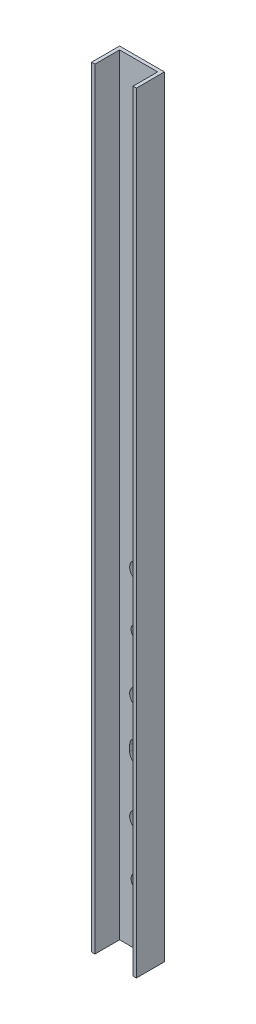
ISO-10303-21;
HEADER;
FILE_DESCRIPTION(('STEP AP214'),'2;1');
FILE_NAME('part.step','',(''),(''),'','','');
FILE_SCHEMA(('AUTOMOTIVE_DESIGN { 1 0 10303 214 1 1 1 1 }'));
ENDSEC;
DATA;
#1=APPLICATION_CONTEXT('core data for automotive mechanical design processes');
#2=APPLICATION_PROTOCOL_DEFINITION('international standard','automotive_design',2000,#1);
#3=PRODUCT_CONTEXT('',#1,'mechanical');
#4=PRODUCT('Part','Part','',(#3));
#5=PRODUCT_RELATED_PRODUCT_CATEGORY('part','',(#4));
#6=PRODUCT_DEFINITION_FORMATION('','',#4);
#7=PRODUCT_DEFINITION_CONTEXT('part definition',#1,'design');
#8=PRODUCT_DEFINITION('design','',#6,#7);
#9=PRODUCT_DEFINITION_SHAPE('','',#8);
#10=(LENGTH_UNIT() NAMED_UNIT(*) SI_UNIT(.MILLI.,.METRE.));
#11=(NAMED_UNIT(*) PLANE_ANGLE_UNIT() SI_UNIT($,.RADIAN.));
#12=(NAMED_UNIT(*) SI_UNIT($,.STERADIAN.) SOLID_ANGLE_UNIT());
#13=UNCERTAINTY_MEASURE_WITH_UNIT(LENGTH_MEASURE(1.E-05),#10,'distance_accuracy_value','');
#14=(GEOMETRIC_REPRESENTATION_CONTEXT(3) GLOBAL_UNCERTAINTY_ASSIGNED_CONTEXT((#13)) GLOBAL_UNIT_ASSIGNED_CONTEXT((#10,
#11,#12)) REPRESENTATION_CONTEXT('',''));
#15=CARTESIAN_POINT('',(0.,0.,0.));
#16=DIRECTION('',(0.,0.,1.));
#17=DIRECTION('',(1.,0.,0.));
#18=AXIS2_PLACEMENT_3D('',#15,#16,#17);
#19=CARTESIAN_POINT('',(0.,275.,0.));
#20=DIRECTION('',(0.,0.,-1.));
#21=DIRECTION('',(-1.,0.,0.));
#22=AXIS2_PLACEMENT_3D('',#19,#20,#21);
#23=PLANE('',#22);
#24=DIRECTION('',(1.,0.,0.));
#25=VECTOR('',#24,1.);
#26=CARTESIAN_POINT('',(0.,0.,0.));
#27=LINE('',#26,#25);
#28=CARTESIAN_POINT('',(0.,0.,0.));
#29=VERTEX_POINT('',#28);
#30=CARTESIAN_POINT('',(1.2,0.,0.));
#31=VERTEX_POINT('',#30);
#32=EDGE_CURVE('E195',#29,#31,#27,.T.);
#33=ORIENTED_EDGE('',*,*,#32,.T.);
#34=DIRECTION('',(0.,-1.,0.));
#35=VECTOR('',#34,1.);
#36=CARTESIAN_POINT('',(1.2,275.,0.));
#37=LINE('',#36,#35);
#38=CARTESIAN_POINT('',(1.2,275.,0.));
#39=VERTEX_POINT('',#38);
#40=EDGE_CURVE('E11',#39,#31,#37,.T.);
#41=ORIENTED_EDGE('',*,*,#40,.F.);
#42=DIRECTION('',(1.,0.,0.));
#43=VECTOR('',#42,1.);
#44=CARTESIAN_POINT('',(0.,275.,0.));
#45=LINE('',#44,#43);
#46=CARTESIAN_POINT('',(0.,275.,0.));
#47=VERTEX_POINT('',#46);
#48=EDGE_CURVE('E196',#47,#39,#45,.T.);
#49=ORIENTED_EDGE('',*,*,#48,.F.);
#50=DIRECTION('',(0.,-1.,0.));
#51=VECTOR('',#50,1.);
#52=CARTESIAN_POINT('',(0.,275.,0.));
#53=LINE('',#52,#51);
#54=EDGE_CURVE('E214',#47,#29,#53,.T.);
#55=ORIENTED_EDGE('',*,*,#54,.T.);
#56=EDGE_LOOP('',(#33,#41,#49,#55));
#57=FACE_BOUND('',#56,.T.);
#58=ADVANCED_FACE('F17',(#57),#23,.F.);
#59=CARTESIAN_POINT('',(1.2,275.,0.));
#60=DIRECTION('',(-1.,0.,0.));
#61=DIRECTION('',(0.,0.,1.));
#62=AXIS2_PLACEMENT_3D('',#59,#60,#61);
#63=PLANE('',#62);
#64=DIRECTION('',(0.,0.,-1.));
#65=VECTOR('',#64,1.);
#66=CARTESIAN_POINT('',(1.2,0.,0.));
#67=LINE('',#66,#65);
#68=CARTESIAN_POINT('',(1.2,0.,-8.8));
#69=VERTEX_POINT('',#68);
#70=EDGE_CURVE('E217',#31,#69,#67,.T.);
#71=ORIENTED_EDGE('',*,*,#70,.T.);
#72=DIRECTION('',(0.,-1.,0.));
#73=VECTOR('',#72,1.);
#74=CARTESIAN_POINT('',(1.2,275.,-8.8));
#75=LINE('',#74,#73);
#76=CARTESIAN_POINT('',(1.2,275.,-8.8));
#77=VERTEX_POINT('',#76);
#78=EDGE_CURVE('E24',#77,#69,#75,.T.);
#79=ORIENTED_EDGE('',*,*,#78,.F.);
#80=DIRECTION('',(0.,0.,-1.));
#81=VECTOR('',#80,1.);
#82=CARTESIAN_POINT('',(1.2,275.,0.));
#83=LINE('',#82,#81);
#84=EDGE_CURVE('E199',#39,#77,#83,.T.);
#85=ORIENTED_EDGE('',*,*,#84,.F.);
#86=ORIENTED_EDGE('',*,*,#40,.T.);
#87=EDGE_LOOP('',(#71,#79,#85,#86));
#88=FACE_BOUND('',#87,.T.);
#89=ADVANCED_FACE('F278',(#88),#63,.F.);
#90=CARTESIAN_POINT('',(1.2,275.,-8.8));
#91=DIRECTION('',(0.,0.,-1.));
#92=DIRECTION('',(-1.,0.,0.));
#93=AXIS2_PLACEMENT_3D('',#90,#91,#92);
#94=PLANE('',#93);
#95=DIRECTION('',(0.,1.,0.));
#96=VECTOR('',#95,1.);
#97=CARTESIAN_POINT('',(4.8000000000001,275.,-8.8));
#98=LINE('',#97,#96);
#99=CARTESIAN_POINT('',(4.8,60.,-8.8));
#100=VERTEX_POINT('',#99);
#101=CARTESIAN_POINT('',(4.8,62.,-8.8));
#102=VERTEX_POINT('',#101);
#103=EDGE_CURVE('E156',#100,#102,#98,.T.);
#104=ORIENTED_EDGE('',*,*,#103,.T.);
#105=CARTESIAN_POINT('',(8.,62.,-8.8));
#106=DIRECTION('',(0.,0.,-1.));
#107=DIRECTION('',(-1.,0.,0.));
#108=AXIS2_PLACEMENT_3D('',#105,#106,#107);
#109=CIRCLE('',#108,3.2);
#110=CARTESIAN_POINT('',(11.2,62.,-8.8));
#111=VERTEX_POINT('',#110);
#112=EDGE_CURVE('E159',#102,#111,#109,.T.);
#113=ORIENTED_EDGE('',*,*,#112,.T.);
#114=DIRECTION('',(0.,-1.,0.));
#115=VECTOR('',#114,1.);
#116=CARTESIAN_POINT('',(11.2,275.,-8.8));
#117=LINE('',#116,#115);
#118=CARTESIAN_POINT('',(11.2,60.,-8.8));
#119=VERTEX_POINT('',#118);
#120=EDGE_CURVE('E147',#111,#119,#117,.T.);
#121=ORIENTED_EDGE('',*,*,#120,.T.);
#122=CARTESIAN_POINT('',(8.,60.,-8.8));
#123=DIRECTION('',(0.,0.,-1.));
#124=DIRECTION('',(-1.,0.,0.));
#125=AXIS2_PLACEMENT_3D('',#122,#123,#124);
#126=CIRCLE('',#125,3.2);
#127=EDGE_CURVE('E120',#119,#100,#126,.T.);
#128=ORIENTED_EDGE('',*,*,#127,.T.);
#129=EDGE_LOOP('',(#104,#113,#121,#128));
#130=FACE_BOUND('',#129,.T.);
#131=CARTESIAN_POINT('',(8.,98.,-8.8));
#132=DIRECTION('',(0.,0.,-1.));
#133=DIRECTION('',(-1.,0.,0.));
#134=AXIS2_PLACEMENT_3D('',#131,#132,#133);
#135=CIRCLE('',#134,2.7);
#136=CARTESIAN_POINT('',(5.3,98.,-8.8));
#137=VERTEX_POINT('',#136);
#138=EDGE_CURVE('E166',#137,#137,#135,.T.);
#139=ORIENTED_EDGE('',*,*,#138,.T.);
#140=EDGE_LOOP('',(#139));
#141=FACE_BOUND('',#140,.T.);
#142=CARTESIAN_POINT('',(8.,117.,-8.8));
#143=DIRECTION('',(0.,0.,-1.));
#144=DIRECTION('',(-1.,0.,0.));
#145=AXIS2_PLACEMENT_3D('',#142,#143,#144);
#146=CIRCLE('',#145,3.2);
#147=CARTESIAN_POINT('',(4.8,117.,-8.8));
#148=VERTEX_POINT('',#147);
#149=EDGE_CURVE('E172',#148,#148,#146,.T.);
#150=ORIENTED_EDGE('',*,*,#149,.T.);
#151=EDGE_LOOP('',(#150));
#152=FACE_BOUND('',#151,.T.);
#153=CARTESIAN_POINT('',(8.,78.,-8.8));
#154=DIRECTION('',(0.,0.,-1.));
#155=DIRECTION('',(-1.,0.,0.));
#156=AXIS2_PLACEMENT_3D('',#153,#154,#155);
#157=CIRCLE('',#156,3.2);
#158=CARTESIAN_POINT('',(4.8,78.,-8.8));
#159=VERTEX_POINT('',#158);
#160=EDGE_CURVE('E179',#159,#159,#157,.T.);
#161=ORIENTED_EDGE('',*,*,#160,.T.);
#162=EDGE_LOOP('',(#161));
#163=FACE_BOUND('',#162,.T.);
#164=CARTESIAN_POINT('',(8.,40.,-8.8));
#165=DIRECTION('',(0.,0.,-1.));
#166=DIRECTION('',(-1.,0.,0.));
#167=AXIS2_PLACEMENT_3D('',#164,#165,#166);
#168=CIRCLE('',#167,3.2);
#169=CARTESIAN_POINT('',(4.8,40.,-8.8));
#170=VERTEX_POINT('',#169);
#171=EDGE_CURVE('E186',#170,#170,#168,.T.);
#172=ORIENTED_EDGE('',*,*,#171,.T.);
#173=EDGE_LOOP('',(#172));
#174=FACE_BOUND('',#173,.T.);
#175=CARTESIAN_POINT('',(8.,21.,-8.8));
#176=DIRECTION('',(0.,0.,-1.));
#177=DIRECTION('',(-1.,0.,0.));
#178=AXIS2_PLACEMENT_3D('',#175,#176,#177);
#179=CIRCLE('',#178,2.7);
#180=CARTESIAN_POINT('',(5.3,21.,-8.8));
#181=VERTEX_POINT('',#180);
#182=EDGE_CURVE('E192',#181,#181,#179,.T.);
#183=ORIENTED_EDGE('',*,*,#182,.T.);
#184=EDGE_LOOP('',(#183));
#185=FACE_BOUND('',#184,.T.);
#186=DIRECTION('',(1.,0.,0.));
#187=VECTOR('',#186,1.);
#188=CARTESIAN_POINT('',(1.2,0.,-8.8));
#189=LINE('',#188,#187);
#190=CARTESIAN_POINT('',(14.8,0.,-8.8));
#191=VERTEX_POINT('',#190);
#192=EDGE_CURVE('E219',#69,#191,#189,.T.);
#193=ORIENTED_EDGE('',*,*,#192,.T.);
#194=DIRECTION('',(0.,-1.,0.));
#195=VECTOR('',#194,1.);
#196=CARTESIAN_POINT('',(14.8,275.,-8.8));
#197=LINE('',#196,#195);
#198=CARTESIAN_POINT('',(14.8,275.,-8.8));
#199=VERTEX_POINT('',#198);
#200=EDGE_CURVE('E247',#199,#191,#197,.T.);
#201=ORIENTED_EDGE('',*,*,#200,.F.);
#202=DIRECTION('',(1.,0.,0.));
#203=VECTOR('',#202,1.);
#204=CARTESIAN_POINT('',(1.2,275.,-8.8));
#205=LINE('',#204,#203);
#206=EDGE_CURVE('E202',#77,#199,#205,.T.);
#207=ORIENTED_EDGE('',*,*,#206,.F.);
#208=ORIENTED_EDGE('',*,*,#78,.T.);
#209=EDGE_LOOP('',(#193,#201,#207,#208));
#210=FACE_BOUND('',#209,.T.);
#211=ADVANCED_FACE('F255',(#130,#141,#152,#163,#174,#185,#210),#94,.F.);
#212=CARTESIAN_POINT('',(14.8,275.,-8.8));
#213=DIRECTION('',(1.,0.,0.));
#214=DIRECTION('',(0.,0.,-1.));
#215=AXIS2_PLACEMENT_3D('',#212,#213,#214);
#216=PLANE('',#215);
#217=DIRECTION('',(0.,0.,1.));
#218=VECTOR('',#217,1.);
#219=CARTESIAN_POINT('',(14.8,0.,-8.8));
#220=LINE('',#219,#218);
#221=CARTESIAN_POINT('',(14.8,0.,0.));
#222=VERTEX_POINT('',#221);
#223=EDGE_CURVE('E221',#191,#222,#220,.T.);
#224=ORIENTED_EDGE('',*,*,#223,.T.);
#225=DIRECTION('',(0.,-1.,0.));
#226=VECTOR('',#225,1.);
#227=CARTESIAN_POINT('',(14.8,275.,0.));
#228=LINE('',#227,#226);
#229=CARTESIAN_POINT('',(14.8,275.,0.));
#230=VERTEX_POINT('',#229);
#231=EDGE_CURVE('E243',#230,#222,#228,.T.);
#232=ORIENTED_EDGE('',*,*,#231,.F.);
#233=DIRECTION('',(0.,0.,1.));
#234=VECTOR('',#233,1.);
#235=CARTESIAN_POINT('',(14.8,275.,-8.8));
#236=LINE('',#235,#234);
#237=EDGE_CURVE('E204',#199,#230,#236,.T.);
#238=ORIENTED_EDGE('',*,*,#237,.F.);
#239=ORIENTED_EDGE('',*,*,#200,.T.);
#240=EDGE_LOOP('',(#224,#232,#238,#239));
#241=FACE_BOUND('',#240,.T.);
#242=ADVANCED_FACE('F266',(#241),#216,.F.);
#243=CARTESIAN_POINT('',(14.8,275.,0.));
#244=DIRECTION('',(0.,0.,-1.));
#245=DIRECTION('',(-1.,0.,0.));
#246=AXIS2_PLACEMENT_3D('',#243,#244,#245);
#247=PLANE('',#246);
#248=DIRECTION('',(1.,0.,0.));
#249=VECTOR('',#248,1.);
#250=CARTESIAN_POINT('',(14.8,0.,0.));
#251=LINE('',#250,#249);
#252=CARTESIAN_POINT('',(16.,0.,0.));
#253=VERTEX_POINT('',#252);
#254=EDGE_CURVE('E223',#222,#253,#251,.T.);
#255=ORIENTED_EDGE('',*,*,#254,.T.);
#256=DIRECTION('',(0.,-1.,0.));
#257=VECTOR('',#256,1.);
#258=CARTESIAN_POINT('',(16.,275.,0.));
#259=LINE('',#258,#257);
#260=CARTESIAN_POINT('',(16.,275.,0.));
#261=VERTEX_POINT('',#260);
#262=EDGE_CURVE('E239',#261,#253,#259,.T.);
#263=ORIENTED_EDGE('',*,*,#262,.F.);
#264=DIRECTION('',(1.,0.,0.));
#265=VECTOR('',#264,1.);
#266=CARTESIAN_POINT('',(14.8,275.,0.));
#267=LINE('',#266,#265);
#268=EDGE_CURVE('E206',#230,#261,#267,.T.);
#269=ORIENTED_EDGE('',*,*,#268,.F.);
#270=ORIENTED_EDGE('',*,*,#231,.T.);
#271=EDGE_LOOP('',(#255,#263,#269,#270));
#272=FACE_BOUND('',#271,.T.);
#273=ADVANCED_FACE('F270',(#272),#247,.F.);
#274=CARTESIAN_POINT('',(16.,275.,-10.));
#275=DIRECTION('',(-1.,0.,0.));
#276=DIRECTION('',(0.,0.,1.));
#277=AXIS2_PLACEMENT_3D('',#274,#275,#276);
#278=PLANE('',#277);
#279=DIRECTION('',(0.,0.,-1.));
#280=VECTOR('',#279,1.);
#281=CARTESIAN_POINT('',(16.,0.,-10.));
#282=LINE('',#281,#280);
#283=CARTESIAN_POINT('',(16.,0.,-10.));
#284=VERTEX_POINT('',#283);
#285=EDGE_CURVE('E225',#253,#284,#282,.T.);
#286=ORIENTED_EDGE('',*,*,#285,.T.);
#287=DIRECTION('',(0.,-1.,0.));
#288=VECTOR('',#287,1.);
#289=CARTESIAN_POINT('',(16.,275.,-10.));
#290=LINE('',#289,#288);
#291=CARTESIAN_POINT('',(16.,275.,-10.));
#292=VERTEX_POINT('',#291);
#293=EDGE_CURVE('E235',#292,#284,#290,.T.);
#294=ORIENTED_EDGE('',*,*,#293,.F.);
#295=DIRECTION('',(0.,0.,-1.));
#296=VECTOR('',#295,1.);
#297=CARTESIAN_POINT('',(16.,275.,-10.));
#298=LINE('',#297,#296);
#299=EDGE_CURVE('E208',#261,#292,#298,.T.);
#300=ORIENTED_EDGE('',*,*,#299,.F.);
#301=ORIENTED_EDGE('',*,*,#262,.T.);
#302=EDGE_LOOP('',(#286,#294,#300,#301));
#303=FACE_BOUND('',#302,.T.);
#304=ADVANCED_FACE('F290',(#303),#278,.F.);
#305=CARTESIAN_POINT('',(0.,275.,-10.));
#306=DIRECTION('',(0.,0.,1.));
#307=DIRECTION('',(1.,0.,0.));
#308=AXIS2_PLACEMENT_3D('',#305,#306,#307);
#309=PLANE('',#308);
#310=DIRECTION('',(0.,-1.,0.));
#311=VECTOR('',#310,1.);
#312=CARTESIAN_POINT('',(11.2,62.,-10.));
#313=LINE('',#312,#311);
#314=CARTESIAN_POINT('',(11.2,62.,-10.));
#315=VERTEX_POINT('',#314);
#316=CARTESIAN_POINT('',(11.2,60.,-10.));
#317=VERTEX_POINT('',#316);
#318=EDGE_CURVE('E127',#315,#317,#313,.T.);
#319=ORIENTED_EDGE('',*,*,#318,.F.);
#320=CARTESIAN_POINT('',(8.,62.,-10.));
#321=DIRECTION('',(0.,0.,-1.));
#322=DIRECTION('',(-1.,0.,0.));
#323=AXIS2_PLACEMENT_3D('',#320,#321,#322);
#324=CIRCLE('',#323,3.2);
#325=CARTESIAN_POINT('',(4.8,62.,-10.));
#326=VERTEX_POINT('',#325);
#327=EDGE_CURVE('E44',#326,#315,#324,.T.);
#328=ORIENTED_EDGE('',*,*,#327,.F.);
#329=DIRECTION('',(0.,1.,0.));
#330=VECTOR('',#329,1.);
#331=CARTESIAN_POINT('',(4.8,62.,-10.));
#332=LINE('',#331,#330);
#333=CARTESIAN_POINT('',(4.8,60.,-10.));
#334=VERTEX_POINT('',#333);
#335=EDGE_CURVE('E135',#334,#326,#332,.T.);
#336=ORIENTED_EDGE('',*,*,#335,.F.);
#337=CARTESIAN_POINT('',(8.,60.,-10.));
#338=DIRECTION('',(0.,0.,-1.));
#339=DIRECTION('',(-1.,0.,0.));
#340=AXIS2_PLACEMENT_3D('',#337,#338,#339);
#341=CIRCLE('',#340,3.2);
#342=EDGE_CURVE('E117',#317,#334,#341,.T.);
#343=ORIENTED_EDGE('',*,*,#342,.F.);
#344=EDGE_LOOP('',(#319,#328,#336,#343));
#345=FACE_BOUND('',#344,.T.);
#346=CARTESIAN_POINT('',(8.,98.,-10.));
#347=DIRECTION('',(0.,0.,-1.));
#348=DIRECTION('',(-1.,0.,0.));
#349=AXIS2_PLACEMENT_3D('',#346,#347,#348);
#350=CIRCLE('',#349,2.7);
#351=CARTESIAN_POINT('',(5.3,98.,-10.));
#352=VERTEX_POINT('',#351);
#353=EDGE_CURVE('E163',#352,#352,#350,.T.);
#354=ORIENTED_EDGE('',*,*,#353,.F.);
#355=EDGE_LOOP('',(#354));
#356=FACE_BOUND('',#355,.T.);
#357=CARTESIAN_POINT('',(8.,117.,-10.));
#358=DIRECTION('',(0.,0.,-1.));
#359=DIRECTION('',(-1.,0.,0.));
#360=AXIS2_PLACEMENT_3D('',#357,#358,#359);
#361=CIRCLE('',#360,3.2);
#362=CARTESIAN_POINT('',(4.8,117.,-10.));
#363=VERTEX_POINT('',#362);
#364=EDGE_CURVE('E169',#363,#363,#361,.T.);
#365=ORIENTED_EDGE('',*,*,#364,.F.);
#366=EDGE_LOOP('',(#365));
#367=FACE_BOUND('',#366,.T.);
#368=CARTESIAN_POINT('',(8.,78.,-10.));
#369=DIRECTION('',(0.,0.,-1.));
#370=DIRECTION('',(-1.,0.,0.));
#371=AXIS2_PLACEMENT_3D('',#368,#369,#370);
#372=CIRCLE('',#371,3.2);
#373=CARTESIAN_POINT('',(4.8,78.,-10.));
#374=VERTEX_POINT('',#373);
#375=EDGE_CURVE('E175',#374,#374,#372,.T.);
#376=ORIENTED_EDGE('',*,*,#375,.F.);
#377=EDGE_LOOP('',(#376));
#378=FACE_BOUND('',#377,.T.);
#379=CARTESIAN_POINT('',(8.,40.,-10.));
#380=DIRECTION('',(0.,0.,-1.));
#381=DIRECTION('',(-1.,0.,0.));
#382=AXIS2_PLACEMENT_3D('',#379,#380,#381);
#383=CIRCLE('',#382,3.2);
#384=CARTESIAN_POINT('',(4.8,40.,-10.));
#385=VERTEX_POINT('',#384);
#386=EDGE_CURVE('E183',#385,#385,#383,.T.);
#387=ORIENTED_EDGE('',*,*,#386,.F.);
#388=EDGE_LOOP('',(#387));
#389=FACE_BOUND('',#388,.T.);
#390=CARTESIAN_POINT('',(8.,21.,-10.));
#391=DIRECTION('',(0.,0.,-1.));
#392=DIRECTION('',(-1.,0.,0.));
#393=AXIS2_PLACEMENT_3D('',#390,#391,#392);
#394=CIRCLE('',#393,2.7);
#395=CARTESIAN_POINT('',(5.3,21.,-10.));
#396=VERTEX_POINT('',#395);
#397=EDGE_CURVE('E189',#396,#396,#394,.T.);
#398=ORIENTED_EDGE('',*,*,#397,.F.);
#399=EDGE_LOOP('',(#398));
#400=FACE_BOUND('',#399,.T.);
#401=DIRECTION('',(-1.,0.,0.));
#402=VECTOR('',#401,1.);
#403=CARTESIAN_POINT('',(0.,0.,-10.));
#404=LINE('',#403,#402);
#405=CARTESIAN_POINT('',(0.,0.,-10.));
#406=VERTEX_POINT('',#405);
#407=EDGE_CURVE('E227',#284,#406,#404,.T.);
#408=ORIENTED_EDGE('',*,*,#407,.T.);
#409=DIRECTION('',(0.,-1.,0.));
#410=VECTOR('',#409,1.);
#411=CARTESIAN_POINT('',(0.,275.,-10.));
#412=LINE('',#411,#410);
#413=CARTESIAN_POINT('',(0.,275.,-10.));
#414=VERTEX_POINT('',#413);
#415=EDGE_CURVE('E232',#414,#406,#412,.T.);
#416=ORIENTED_EDGE('',*,*,#415,.F.);
#417=DIRECTION('',(-1.,0.,0.));
#418=VECTOR('',#417,1.);
#419=CARTESIAN_POINT('',(0.,275.,-10.));
#420=LINE('',#419,#418);
#421=EDGE_CURVE('E210',#292,#414,#420,.T.);
#422=ORIENTED_EDGE('',*,*,#421,.F.);
#423=ORIENTED_EDGE('',*,*,#293,.T.);
#424=EDGE_LOOP('',(#408,#416,#422,#423));
#425=FACE_BOUND('',#424,.T.);
#426=ADVANCED_FACE('F132',(#345,#356,#367,#378,#389,#400,#425),#309,.F.);
#427=CARTESIAN_POINT('',(0.,275.,0.));
#428=DIRECTION('',(1.,0.,0.));
#429=DIRECTION('',(0.,0.,-1.));
#430=AXIS2_PLACEMENT_3D('',#427,#428,#429);
#431=PLANE('',#430);
#432=DIRECTION('',(0.,0.,1.));
#433=VECTOR('',#432,1.);
#434=CARTESIAN_POINT('',(0.,0.,0.));
#435=LINE('',#434,#433);
#436=EDGE_CURVE('E200',#406,#29,#435,.T.);
#437=ORIENTED_EDGE('',*,*,#436,.T.);
#438=ORIENTED_EDGE('',*,*,#54,.F.);
#439=DIRECTION('',(0.,0.,1.));
#440=VECTOR('',#439,1.);
#441=CARTESIAN_POINT('',(0.,275.,0.));
#442=LINE('',#441,#440);
#443=EDGE_CURVE('E212',#414,#47,#442,.T.);
#444=ORIENTED_EDGE('',*,*,#443,.F.);
#445=ORIENTED_EDGE('',*,*,#415,.T.);
#446=EDGE_LOOP('',(#437,#438,#444,#445));
#447=FACE_BOUND('',#446,.T.);
#448=ADVANCED_FACE('F284',(#447),#431,.F.);
#449=CARTESIAN_POINT('',(0.,275.,0.));
#450=DIRECTION('',(0.,1.,0.));
#451=DIRECTION('',(0.,0.,1.));
#452=AXIS2_PLACEMENT_3D('',#449,#450,#451);
#453=PLANE('',#452);
#454=ORIENTED_EDGE('',*,*,#48,.T.);
#455=ORIENTED_EDGE('',*,*,#84,.T.);
#456=ORIENTED_EDGE('',*,*,#206,.T.);
#457=ORIENTED_EDGE('',*,*,#237,.T.);
#458=ORIENTED_EDGE('',*,*,#268,.T.);
#459=ORIENTED_EDGE('',*,*,#299,.T.);
#460=ORIENTED_EDGE('',*,*,#421,.T.);
#461=ORIENTED_EDGE('',*,*,#443,.T.);
#462=EDGE_LOOP('',(#454,#455,#456,#457,#458,#459,#460,#461));
#463=FACE_BOUND('',#462,.T.);
#464=ADVANCED_FACE('F274',(#463),#453,.T.);
#465=CARTESIAN_POINT('',(0.,0.,0.));
#466=DIRECTION('',(0.,1.,0.));
#467=DIRECTION('',(0.,0.,1.));
#468=AXIS2_PLACEMENT_3D('',#465,#466,#467);
#469=PLANE('',#468);
#470=ORIENTED_EDGE('',*,*,#32,.F.);
#471=ORIENTED_EDGE('',*,*,#436,.F.);
#472=ORIENTED_EDGE('',*,*,#407,.F.);
#473=ORIENTED_EDGE('',*,*,#285,.F.);
#474=ORIENTED_EDGE('',*,*,#254,.F.);
#475=ORIENTED_EDGE('',*,*,#223,.F.);
#476=ORIENTED_EDGE('',*,*,#192,.F.);
#477=ORIENTED_EDGE('',*,*,#70,.F.);
#478=EDGE_LOOP('',(#470,#471,#472,#473,#474,#475,#476,#477));
#479=FACE_BOUND('',#478,.T.);
#480=ADVANCED_FACE('F261',(#479),#469,.F.);
#481=CARTESIAN_POINT('',(8.,21.,0.));
#482=DIRECTION('',(0.,0.,-1.));
#483=DIRECTION('',(-1.,0.,0.));
#484=AXIS2_PLACEMENT_3D('',#481,#482,#483);
#485=CYLINDRICAL_SURFACE('',#484,2.7);
#486=ORIENTED_EDGE('',*,*,#397,.T.);
#487=EDGE_LOOP('',(#486));
#488=FACE_BOUND('',#487,.T.);
#489=ORIENTED_EDGE('',*,*,#182,.F.);
#490=EDGE_LOOP('',(#489));
#491=FACE_BOUND('',#490,.T.);
#492=ADVANCED_FACE('F355',(#488,#491),#485,.F.);
#493=CARTESIAN_POINT('',(8.,40.,0.));
#494=DIRECTION('',(0.,0.,-1.));
#495=DIRECTION('',(-1.,0.,0.));
#496=AXIS2_PLACEMENT_3D('',#493,#494,#495);
#497=CYLINDRICAL_SURFACE('',#496,3.2);
#498=ORIENTED_EDGE('',*,*,#386,.T.);
#499=EDGE_LOOP('',(#498));
#500=FACE_BOUND('',#499,.T.);
#501=ORIENTED_EDGE('',*,*,#171,.F.);
#502=EDGE_LOOP('',(#501));
#503=FACE_BOUND('',#502,.T.);
#504=ADVANCED_FACE('F362',(#500,#503),#497,.F.);
#505=CARTESIAN_POINT('',(8.,78.,0.));
#506=DIRECTION('',(0.,0.,-1.));
#507=DIRECTION('',(-1.,0.,0.));
#508=AXIS2_PLACEMENT_3D('',#505,#506,#507);
#509=CYLINDRICAL_SURFACE('',#508,3.2);
#510=ORIENTED_EDGE('',*,*,#375,.T.);
#511=EDGE_LOOP('',(#510));
#512=FACE_BOUND('',#511,.T.);
#513=ORIENTED_EDGE('',*,*,#160,.F.);
#514=EDGE_LOOP('',(#513));
#515=FACE_BOUND('',#514,.T.);
#516=ADVANCED_FACE('F370',(#512,#515),#509,.F.);
#517=CARTESIAN_POINT('',(8.,117.,0.));
#518=DIRECTION('',(0.,0.,-1.));
#519=DIRECTION('',(-1.,0.,0.));
#520=AXIS2_PLACEMENT_3D('',#517,#518,#519);
#521=CYLINDRICAL_SURFACE('',#520,3.2);
#522=ORIENTED_EDGE('',*,*,#364,.T.);
#523=EDGE_LOOP('',(#522));
#524=FACE_BOUND('',#523,.T.);
#525=ORIENTED_EDGE('',*,*,#149,.F.);
#526=EDGE_LOOP('',(#525));
#527=FACE_BOUND('',#526,.T.);
#528=ADVANCED_FACE('F378',(#524,#527),#521,.F.);
#529=CARTESIAN_POINT('',(8.,98.,0.));
#530=DIRECTION('',(0.,0.,-1.));
#531=DIRECTION('',(-1.,0.,0.));
#532=AXIS2_PLACEMENT_3D('',#529,#530,#531);
#533=CYLINDRICAL_SURFACE('',#532,2.7);
#534=ORIENTED_EDGE('',*,*,#353,.T.);
#535=EDGE_LOOP('',(#534));
#536=FACE_BOUND('',#535,.T.);
#537=ORIENTED_EDGE('',*,*,#138,.F.);
#538=EDGE_LOOP('',(#537));
#539=FACE_BOUND('',#538,.T.);
#540=ADVANCED_FACE('F386',(#536,#539),#533,.F.);
#541=CARTESIAN_POINT('',(8.,62.,0.));
#542=DIRECTION('',(0.,0.,-1.));
#543=DIRECTION('',(-1.,0.,0.));
#544=AXIS2_PLACEMENT_3D('',#541,#542,#543);
#545=CYLINDRICAL_SURFACE('',#544,3.2);
#546=DIRECTION('',(0.,0.,-1.));
#547=VECTOR('',#546,1.);
#548=CARTESIAN_POINT('',(4.8,62.,0.));
#549=LINE('',#548,#547);
#550=EDGE_CURVE('E144',#102,#326,#549,.T.);
#551=ORIENTED_EDGE('',*,*,#550,.T.);
#552=ORIENTED_EDGE('',*,*,#327,.T.);
#553=DIRECTION('',(0.,0.,-1.));
#554=VECTOR('',#553,1.);
#555=CARTESIAN_POINT('',(11.2,62.,0.));
#556=LINE('',#555,#554);
#557=EDGE_CURVE('E124',#111,#315,#556,.T.);
#558=ORIENTED_EDGE('',*,*,#557,.F.);
#559=ORIENTED_EDGE('',*,*,#112,.F.);
#560=EDGE_LOOP('',(#551,#552,#558,#559));
#561=FACE_BOUND('',#560,.T.);
#562=ADVANCED_FACE('F394',(#561),#545,.F.);
#563=CARTESIAN_POINT('',(4.8,62.,0.));
#564=DIRECTION('',(-1.,0.,0.));
#565=DIRECTION('',(0.,-1.,0.));
#566=AXIS2_PLACEMENT_3D('',#563,#564,#565);
#567=PLANE('',#566);
#568=DIRECTION('',(0.,0.,-1.));
#569=VECTOR('',#568,1.);
#570=CARTESIAN_POINT('',(4.8,60.,0.));
#571=LINE('',#570,#569);
#572=EDGE_CURVE('E123',#100,#334,#571,.T.);
#573=ORIENTED_EDGE('',*,*,#572,.T.);
#574=ORIENTED_EDGE('',*,*,#335,.T.);
#575=ORIENTED_EDGE('',*,*,#550,.F.);
#576=ORIENTED_EDGE('',*,*,#103,.F.);
#577=EDGE_LOOP('',(#573,#574,#575,#576));
#578=FACE_BOUND('',#577,.T.);
#579=ADVANCED_FACE('F402',(#578),#567,.F.);
#580=CARTESIAN_POINT('',(8.,60.,0.));
#581=DIRECTION('',(0.,0.,-1.));
#582=DIRECTION('',(-1.,0.,0.));
#583=AXIS2_PLACEMENT_3D('',#580,#581,#582);
#584=CYLINDRICAL_SURFACE('',#583,3.2);
#585=DIRECTION('',(0.,0.,-1.));
#586=VECTOR('',#585,1.);
#587=CARTESIAN_POINT('',(11.2,60.,0.));
#588=LINE('',#587,#586);
#589=EDGE_CURVE('E35',#119,#317,#588,.T.);
#590=ORIENTED_EDGE('',*,*,#589,.T.);
#591=ORIENTED_EDGE('',*,*,#342,.T.);
#592=ORIENTED_EDGE('',*,*,#572,.F.);
#593=ORIENTED_EDGE('',*,*,#127,.F.);
#594=EDGE_LOOP('',(#590,#591,#592,#593));
#595=FACE_BOUND('',#594,.T.);
#596=ADVANCED_FACE('F114',(#595),#584,.F.);
#597=CARTESIAN_POINT('',(11.2,62.,0.));
#598=DIRECTION('',(1.,0.,0.));
#599=DIRECTION('',(0.,0.,-1.));
#600=AXIS2_PLACEMENT_3D('',#597,#598,#599);
#601=PLANE('',#600);
#602=ORIENTED_EDGE('',*,*,#557,.T.);
#603=ORIENTED_EDGE('',*,*,#318,.T.);
#604=ORIENTED_EDGE('',*,*,#589,.F.);
#605=ORIENTED_EDGE('',*,*,#120,.F.);
#606=EDGE_LOOP('',(#602,#603,#604,#605));
#607=FACE_BOUND('',#606,.T.);
#608=ADVANCED_FACE('F128',(#607),#601,.F.);
#609=CLOSED_SHELL('',(#58,#89,#211,#242,#273,#304,#426,#448,#464,#480,#492,#504,#516,#528,#540,
#562,#579,#596,#608));
#610=MANIFOLD_SOLID_BREP('B1',#609);
#611=ADVANCED_BREP_SHAPE_REPRESENTATION('',(#18,#610),#14);
#612=SHAPE_DEFINITION_REPRESENTATION(#9,#611);
ENDSEC;
END-ISO-10303-21;
